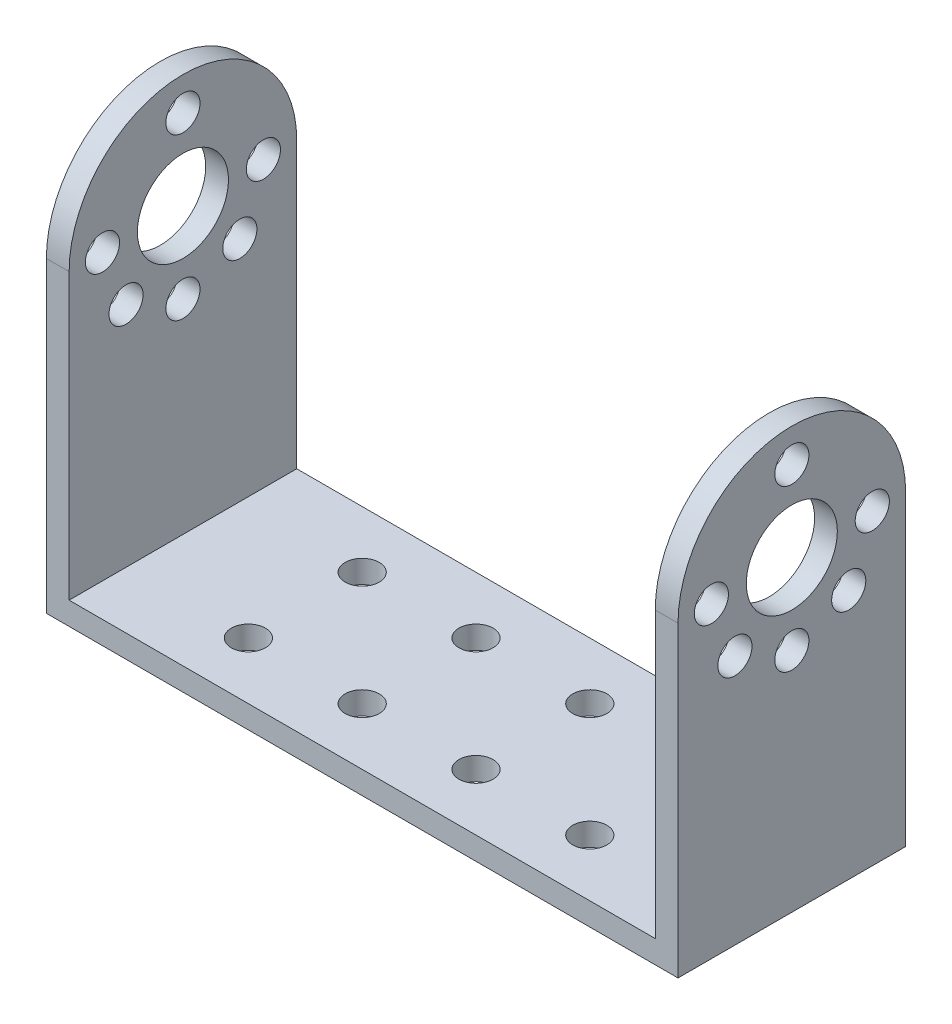
ISO-10303-21;
HEADER;
FILE_DESCRIPTION(('STEP AP214'),'2;1');
FILE_NAME('part.step','',(''),(''),'','','');
FILE_SCHEMA(('AUTOMOTIVE_DESIGN { 1 0 10303 214 1 1 1 1 }'));
ENDSEC;
DATA;
#1=APPLICATION_CONTEXT('core data for automotive mechanical design processes');
#2=APPLICATION_PROTOCOL_DEFINITION('international standard','automotive_design',2000,#1);
#3=PRODUCT_CONTEXT('',#1,'mechanical');
#4=PRODUCT('Part','Part','',(#3));
#5=PRODUCT_RELATED_PRODUCT_CATEGORY('part','',(#4));
#6=PRODUCT_DEFINITION_FORMATION('','',#4);
#7=PRODUCT_DEFINITION_CONTEXT('part definition',#1,'design');
#8=PRODUCT_DEFINITION('design','',#6,#7);
#9=PRODUCT_DEFINITION_SHAPE('','',#8);
#10=(LENGTH_UNIT() NAMED_UNIT(*) SI_UNIT(.MILLI.,.METRE.));
#11=(NAMED_UNIT(*) PLANE_ANGLE_UNIT() SI_UNIT($,.RADIAN.));
#12=(NAMED_UNIT(*) SI_UNIT($,.STERADIAN.) SOLID_ANGLE_UNIT());
#13=UNCERTAINTY_MEASURE_WITH_UNIT(LENGTH_MEASURE(1.E-05),#10,'distance_accuracy_value','');
#14=(GEOMETRIC_REPRESENTATION_CONTEXT(3) GLOBAL_UNCERTAINTY_ASSIGNED_CONTEXT((#13)) GLOBAL_UNIT_ASSIGNED_CONTEXT((#10,
#11,#12)) REPRESENTATION_CONTEXT('',''));
#15=CARTESIAN_POINT('',(0.,0.,0.));
#16=DIRECTION('',(0.,0.,1.));
#17=DIRECTION('',(1.,0.,0.));
#18=AXIS2_PLACEMENT_3D('',#15,#16,#17);
#19=CARTESIAN_POINT('',(-27.75,2.,10.));
#20=DIRECTION('',(1.,0.,0.));
#21=DIRECTION('',(0.,0.,-1.));
#22=AXIS2_PLACEMENT_3D('',#19,#20,#21);
#23=PLANE('',#22);
#24=CARTESIAN_POINT('',(-27.75,27.,7.07000000000007));
#25=DIRECTION('',(1.,0.,0.));
#26=DIRECTION('',(0.,0.,-1.));
#27=AXIS2_PLACEMENT_3D('',#24,#25,#26);
#28=CIRCLE('',#27,1.5);
#29=CARTESIAN_POINT('',(-27.75,27.,5.57000000000006));
#30=VERTEX_POINT('',#29);
#31=EDGE_CURVE('E278',#30,#30,#28,.T.);
#32=ORIENTED_EDGE('',*,*,#31,.T.);
#33=EDGE_LOOP('',(#32));
#34=FACE_BOUND('',#33,.T.);
#35=CARTESIAN_POINT('',(-27.75,22.0007550570111,4.99924494298895));
#36=DIRECTION('',(1.,0.,0.));
#37=DIRECTION('',(0.,0.,-1.));
#38=AXIS2_PLACEMENT_3D('',#35,#36,#37);
#39=CIRCLE('',#38,1.5);
#40=CARTESIAN_POINT('',(-27.75,22.0007550570111,3.49924494298895));
#41=VERTEX_POINT('',#40);
#42=EDGE_CURVE('E275',#41,#41,#39,.T.);
#43=ORIENTED_EDGE('',*,*,#42,.T.);
#44=EDGE_LOOP('',(#43));
#45=FACE_BOUND('',#44,.T.);
#46=CARTESIAN_POINT('',(-27.75,19.93,0.));
#47=DIRECTION('',(1.,0.,0.));
#48=DIRECTION('',(0.,0.,-1.));
#49=AXIS2_PLACEMENT_3D('',#46,#47,#48);
#50=CIRCLE('',#49,1.5);
#51=CARTESIAN_POINT('',(-27.75,19.93,-1.49999999999994));
#52=VERTEX_POINT('',#51);
#53=EDGE_CURVE('E293',#52,#52,#50,.F.);
#54=ORIENTED_EDGE('',*,*,#53,.F.);
#55=EDGE_LOOP('',(#54));
#56=FACE_BOUND('',#55,.T.);
#57=CARTESIAN_POINT('',(-27.75,22.0007550570111,-4.99924494298887));
#58=DIRECTION('',(1.,0.,0.));
#59=DIRECTION('',(0.,0.,-1.));
#60=AXIS2_PLACEMENT_3D('',#57,#58,#59);
#61=CIRCLE('',#60,1.5);
#62=CARTESIAN_POINT('',(-27.75,22.0007550570111,-6.49924494298887));
#63=VERTEX_POINT('',#62);
#64=EDGE_CURVE('E300',#63,#63,#61,.T.);
#65=ORIENTED_EDGE('',*,*,#64,.T.);
#66=EDGE_LOOP('',(#65));
#67=FACE_BOUND('',#66,.T.);
#68=CARTESIAN_POINT('',(-27.75,34.07,0.));
#69=DIRECTION('',(1.,0.,0.));
#70=DIRECTION('',(0.,0.,-1.));
#71=AXIS2_PLACEMENT_3D('',#68,#69,#70);
#72=CIRCLE('',#71,1.5);
#73=CARTESIAN_POINT('',(-27.75,34.07,-1.49999999999994));
#74=VERTEX_POINT('',#73);
#75=EDGE_CURVE('E307',#74,#74,#72,.T.);
#76=ORIENTED_EDGE('',*,*,#75,.T.);
#77=EDGE_LOOP('',(#76));
#78=FACE_BOUND('',#77,.T.);
#79=CARTESIAN_POINT('',(-27.75,27.,0.));
#80=DIRECTION('',(1.,0.,0.));
#81=DIRECTION('',(0.,0.,-1.));
#82=AXIS2_PLACEMENT_3D('',#79,#80,#81);
#83=CIRCLE('',#82,4.);
#84=CARTESIAN_POINT('',(-27.75,27.,-3.99999999999994));
#85=VERTEX_POINT('',#84);
#86=EDGE_CURVE('E314',#85,#85,#83,.T.);
#87=ORIENTED_EDGE('',*,*,#86,.T.);
#88=EDGE_LOOP('',(#87));
#89=FACE_BOUND('',#88,.T.);
#90=CARTESIAN_POINT('',(-27.75,27.,-7.06999999999995));
#91=DIRECTION('',(1.,0.,0.));
#92=DIRECTION('',(0.,0.,-1.));
#93=AXIS2_PLACEMENT_3D('',#90,#91,#92);
#94=CIRCLE('',#93,1.5);
#95=CARTESIAN_POINT('',(-27.75,27.,-8.56999999999995));
#96=VERTEX_POINT('',#95);
#97=EDGE_CURVE('E205',#96,#96,#94,.F.);
#98=ORIENTED_EDGE('',*,*,#97,.F.);
#99=EDGE_LOOP('',(#98));
#100=FACE_BOUND('',#99,.T.);
#101=CARTESIAN_POINT('',(-27.75,27.,0.));
#102=DIRECTION('',(1.,0.,0.));
#103=DIRECTION('',(0.,0.,-1.));
#104=AXIS2_PLACEMENT_3D('',#101,#102,#103);
#105=CIRCLE('',#104,10.);
#106=CARTESIAN_POINT('',(-27.75,27.,-9.99999999999994));
#107=VERTEX_POINT('',#106);
#108=CARTESIAN_POINT('',(-27.75,27.,10.0000000000001));
#109=VERTEX_POINT('',#108);
#110=EDGE_CURVE('E329',#107,#109,#105,.T.);
#111=ORIENTED_EDGE('',*,*,#110,.F.);
#112=DIRECTION('',(0.,-1.,0.));
#113=VECTOR('',#112,1.);
#114=CARTESIAN_POINT('',(-27.75,2.,-9.99999999999998));
#115=LINE('',#114,#113);
#116=CARTESIAN_POINT('',(-27.75,0.,-9.99999999999998));
#117=VERTEX_POINT('',#116);
#118=EDGE_CURVE('E211',#107,#117,#115,.T.);
#119=ORIENTED_EDGE('',*,*,#118,.T.);
#120=DIRECTION('',(0.,0.,1.));
#121=VECTOR('',#120,1.);
#122=CARTESIAN_POINT('',(-27.75,0.,10.));
#123=LINE('',#122,#121);
#124=CARTESIAN_POINT('',(-27.75,0.,10.));
#125=VERTEX_POINT('',#124);
#126=EDGE_CURVE('E232',#117,#125,#123,.T.);
#127=ORIENTED_EDGE('',*,*,#126,.T.);
#128=DIRECTION('',(0.,-1.,0.));
#129=VECTOR('',#128,1.);
#130=CARTESIAN_POINT('',(-27.75,2.,10.));
#131=LINE('',#130,#129);
#132=EDGE_CURVE('E12',#109,#125,#131,.T.);
#133=ORIENTED_EDGE('',*,*,#132,.F.);
#134=EDGE_LOOP('',(#111,#119,#127,#133));
#135=FACE_BOUND('',#134,.T.);
#136=ADVANCED_FACE('F117',(#34,#45,#56,#67,#78,#89,#100,#135),#23,.F.);
#137=CARTESIAN_POINT('',(27.75,2.,9.99999999999999));
#138=DIRECTION('',(-1.,0.,0.));
#139=DIRECTION('',(0.,0.,1.));
#140=AXIS2_PLACEMENT_3D('',#137,#138,#139);
#141=PLANE('',#140);
#142=CARTESIAN_POINT('',(27.75,27.,7.06999999999999));
#143=DIRECTION('',(1.,0.,0.));
#144=DIRECTION('',(0.,0.,-1.));
#145=AXIS2_PLACEMENT_3D('',#142,#143,#144);
#146=CIRCLE('',#145,1.5);
#147=CARTESIAN_POINT('',(27.75,27.,5.56999999999999));
#148=VERTEX_POINT('',#147);
#149=EDGE_CURVE('E696',#148,#148,#146,.T.);
#150=ORIENTED_EDGE('',*,*,#149,.F.);
#151=EDGE_LOOP('',(#150));
#152=FACE_BOUND('',#151,.T.);
#153=CARTESIAN_POINT('',(27.75,22.0007550570111,4.99924494298887));
#154=DIRECTION('',(1.,0.,0.));
#155=DIRECTION('',(0.,0.,-1.));
#156=AXIS2_PLACEMENT_3D('',#153,#154,#155);
#157=CIRCLE('',#156,1.5);
#158=CARTESIAN_POINT('',(27.75,22.0007550570111,3.49924494298888));
#159=VERTEX_POINT('',#158);
#160=EDGE_CURVE('E271',#159,#159,#157,.T.);
#161=ORIENTED_EDGE('',*,*,#160,.F.);
#162=EDGE_LOOP('',(#161));
#163=FACE_BOUND('',#162,.T.);
#164=CARTESIAN_POINT('',(27.75,19.93,0.));
#165=DIRECTION('',(1.,0.,0.));
#166=DIRECTION('',(0.,0.,-1.));
#167=AXIS2_PLACEMENT_3D('',#164,#165,#166);
#168=CIRCLE('',#167,1.5);
#169=CARTESIAN_POINT('',(27.75,19.93,-1.50000000000001));
#170=VERTEX_POINT('',#169);
#171=EDGE_CURVE('E267',#170,#170,#168,.F.);
#172=ORIENTED_EDGE('',*,*,#171,.T.);
#173=EDGE_LOOP('',(#172));
#174=FACE_BOUND('',#173,.T.);
#175=CARTESIAN_POINT('',(27.75,22.0007550570111,-4.99924494298894));
#176=DIRECTION('',(1.,0.,0.));
#177=DIRECTION('',(0.,0.,-1.));
#178=AXIS2_PLACEMENT_3D('',#175,#176,#177);
#179=CIRCLE('',#178,1.5);
#180=CARTESIAN_POINT('',(27.75,22.0007550570111,-6.49924494298894));
#181=VERTEX_POINT('',#180);
#182=EDGE_CURVE('E263',#181,#181,#179,.T.);
#183=ORIENTED_EDGE('',*,*,#182,.F.);
#184=EDGE_LOOP('',(#183));
#185=FACE_BOUND('',#184,.T.);
#186=CARTESIAN_POINT('',(27.75,34.07,0.));
#187=DIRECTION('',(1.,0.,0.));
#188=DIRECTION('',(0.,0.,-1.));
#189=AXIS2_PLACEMENT_3D('',#186,#187,#188);
#190=CIRCLE('',#189,1.5);
#191=CARTESIAN_POINT('',(27.75,34.07,-1.50000000000001));
#192=VERTEX_POINT('',#191);
#193=EDGE_CURVE('E258',#192,#192,#190,.T.);
#194=ORIENTED_EDGE('',*,*,#193,.F.);
#195=EDGE_LOOP('',(#194));
#196=FACE_BOUND('',#195,.T.);
#197=CARTESIAN_POINT('',(27.75,27.,0.));
#198=DIRECTION('',(1.,0.,0.));
#199=DIRECTION('',(0.,0.,-1.));
#200=AXIS2_PLACEMENT_3D('',#197,#198,#199);
#201=CIRCLE('',#200,4.);
#202=CARTESIAN_POINT('',(27.75,27.,-4.00000000000001));
#203=VERTEX_POINT('',#202);
#204=EDGE_CURVE('E253',#203,#203,#201,.T.);
#205=ORIENTED_EDGE('',*,*,#204,.F.);
#206=EDGE_LOOP('',(#205));
#207=FACE_BOUND('',#206,.T.);
#208=CARTESIAN_POINT('',(27.75,27.,-7.07000000000003));
#209=DIRECTION('',(1.,0.,0.));
#210=DIRECTION('',(0.,0.,-1.));
#211=AXIS2_PLACEMENT_3D('',#208,#209,#210);
#212=CIRCLE('',#211,1.5);
#213=CARTESIAN_POINT('',(27.75,27.,-8.57000000000003));
#214=VERTEX_POINT('',#213);
#215=EDGE_CURVE('E248',#214,#214,#212,.F.);
#216=ORIENTED_EDGE('',*,*,#215,.T.);
#217=EDGE_LOOP('',(#216));
#218=FACE_BOUND('',#217,.T.);
#219=DIRECTION('',(0.,-1.,0.));
#220=VECTOR('',#219,1.);
#221=CARTESIAN_POINT('',(27.75,2.,-10.));
#222=LINE('',#221,#220);
#223=CARTESIAN_POINT('',(27.75,27.,-10.));
#224=VERTEX_POINT('',#223);
#225=CARTESIAN_POINT('',(27.75,0.,-10.));
#226=VERTEX_POINT('',#225);
#227=EDGE_CURVE('E201',#224,#226,#222,.T.);
#228=ORIENTED_EDGE('',*,*,#227,.F.);
#229=CARTESIAN_POINT('',(27.75,27.,0.));
#230=DIRECTION('',(1.,0.,0.));
#231=DIRECTION('',(0.,0.,-1.));
#232=AXIS2_PLACEMENT_3D('',#229,#230,#231);
#233=CIRCLE('',#232,10.);
#234=CARTESIAN_POINT('',(27.75,27.,9.99999999999999));
#235=VERTEX_POINT('',#234);
#236=EDGE_CURVE('E186',#224,#235,#233,.T.);
#237=ORIENTED_EDGE('',*,*,#236,.T.);
#238=DIRECTION('',(0.,-1.,0.));
#239=VECTOR('',#238,1.);
#240=CARTESIAN_POINT('',(27.75,2.,9.99999999999999));
#241=LINE('',#240,#239);
#242=CARTESIAN_POINT('',(27.75,0.,9.99999999999999));
#243=VERTEX_POINT('',#242);
#244=EDGE_CURVE('E125',#235,#243,#241,.T.);
#245=ORIENTED_EDGE('',*,*,#244,.T.);
#246=DIRECTION('',(0.,0.,-1.));
#247=VECTOR('',#246,1.);
#248=CARTESIAN_POINT('',(27.75,0.,9.99999999999999));
#249=LINE('',#248,#247);
#250=EDGE_CURVE('E209',#243,#226,#249,.T.);
#251=ORIENTED_EDGE('',*,*,#250,.T.);
#252=EDGE_LOOP('',(#228,#237,#245,#251));
#253=FACE_BOUND('',#252,.T.);
#254=ADVANCED_FACE('F207',(#152,#163,#174,#185,#196,#207,#218,#253),#141,.F.);
#255=CARTESIAN_POINT('',(-25.75,37.,-9.99999999999998));
#256=DIRECTION('',(-1.,0.,0.));
#257=DIRECTION('',(0.,0.,1.));
#258=AXIS2_PLACEMENT_3D('',#255,#256,#257);
#259=PLANE('',#258);
#260=CARTESIAN_POINT('',(-25.75,27.,7.07000000000006));
#261=DIRECTION('',(-1.,0.,0.));
#262=DIRECTION('',(0.,0.,1.));
#263=AXIS2_PLACEMENT_3D('',#260,#261,#262);
#264=CIRCLE('',#263,1.5);
#265=CARTESIAN_POINT('',(-25.75,27.,8.57000000000006));
#266=VERTEX_POINT('',#265);
#267=EDGE_CURVE('E283',#266,#266,#264,.T.);
#268=ORIENTED_EDGE('',*,*,#267,.T.);
#269=EDGE_LOOP('',(#268));
#270=FACE_BOUND('',#269,.T.);
#271=CARTESIAN_POINT('',(-25.75,22.0007550570111,4.99924494298895));
#272=DIRECTION('',(-1.,0.,0.));
#273=DIRECTION('',(0.,0.,1.));
#274=AXIS2_PLACEMENT_3D('',#271,#272,#273);
#275=CIRCLE('',#274,1.5);
#276=CARTESIAN_POINT('',(-25.75,22.0007550570111,6.49924494298895));
#277=VERTEX_POINT('',#276);
#278=EDGE_CURVE('E270',#277,#277,#275,.T.);
#279=ORIENTED_EDGE('',*,*,#278,.T.);
#280=EDGE_LOOP('',(#279));
#281=FACE_BOUND('',#280,.T.);
#282=CARTESIAN_POINT('',(-25.75,19.93,0.));
#283=DIRECTION('',(-1.,0.,0.));
#284=DIRECTION('',(0.,0.,1.));
#285=AXIS2_PLACEMENT_3D('',#282,#283,#284);
#286=CIRCLE('',#285,1.5);
#287=CARTESIAN_POINT('',(-25.75,19.93,1.50000000000006));
#288=VERTEX_POINT('',#287);
#289=EDGE_CURVE('E266',#288,#288,#286,.F.);
#290=ORIENTED_EDGE('',*,*,#289,.F.);
#291=EDGE_LOOP('',(#290));
#292=FACE_BOUND('',#291,.T.);
#293=CARTESIAN_POINT('',(-25.75,22.0007550570111,-4.99924494298887));
#294=DIRECTION('',(-1.,0.,0.));
#295=DIRECTION('',(0.,0.,1.));
#296=AXIS2_PLACEMENT_3D('',#293,#294,#295);
#297=CIRCLE('',#296,1.5);
#298=CARTESIAN_POINT('',(-25.75,22.0007550570111,-3.49924494298887));
#299=VERTEX_POINT('',#298);
#300=EDGE_CURVE('E262',#299,#299,#297,.T.);
#301=ORIENTED_EDGE('',*,*,#300,.T.);
#302=EDGE_LOOP('',(#301));
#303=FACE_BOUND('',#302,.T.);
#304=CARTESIAN_POINT('',(-25.75,34.07,0.));
#305=DIRECTION('',(-1.,0.,0.));
#306=DIRECTION('',(0.,0.,1.));
#307=AXIS2_PLACEMENT_3D('',#304,#305,#306);
#308=CIRCLE('',#307,1.5);
#309=CARTESIAN_POINT('',(-25.75,34.07,1.50000000000006));
#310=VERTEX_POINT('',#309);
#311=EDGE_CURVE('E257',#310,#310,#308,.T.);
#312=ORIENTED_EDGE('',*,*,#311,.T.);
#313=EDGE_LOOP('',(#312));
#314=FACE_BOUND('',#313,.T.);
#315=CARTESIAN_POINT('',(-25.75,27.,0.));
#316=DIRECTION('',(-1.,0.,0.));
#317=DIRECTION('',(0.,0.,1.));
#318=AXIS2_PLACEMENT_3D('',#315,#316,#317);
#319=CIRCLE('',#318,4.);
#320=CARTESIAN_POINT('',(-25.75,27.,4.00000000000006));
#321=VERTEX_POINT('',#320);
#322=EDGE_CURVE('E252',#321,#321,#319,.T.);
#323=ORIENTED_EDGE('',*,*,#322,.T.);
#324=EDGE_LOOP('',(#323));
#325=FACE_BOUND('',#324,.T.);
#326=CARTESIAN_POINT('',(-25.75,27.,-7.06999999999995));
#327=DIRECTION('',(-1.,0.,0.));
#328=DIRECTION('',(0.,0.,1.));
#329=AXIS2_PLACEMENT_3D('',#326,#327,#328);
#330=CIRCLE('',#329,1.5);
#331=CARTESIAN_POINT('',(-25.75,27.,-5.56999999999995));
#332=VERTEX_POINT('',#331);
#333=EDGE_CURVE('E247',#332,#332,#330,.F.);
#334=ORIENTED_EDGE('',*,*,#333,.F.);
#335=EDGE_LOOP('',(#334));
#336=FACE_BOUND('',#335,.T.);
#337=DIRECTION('',(0.,-1.,0.));
#338=VECTOR('',#337,1.);
#339=CARTESIAN_POINT('',(-25.75,37.,-9.99999999999998));
#340=LINE('',#339,#338);
#341=CARTESIAN_POINT('',(-25.75,27.,-9.99999999999994));
#342=VERTEX_POINT('',#341);
#343=CARTESIAN_POINT('',(-25.75,2.,-9.99999999999998));
#344=VERTEX_POINT('',#343);
#345=EDGE_CURVE('E241',#342,#344,#340,.T.);
#346=ORIENTED_EDGE('',*,*,#345,.F.);
#347=CARTESIAN_POINT('',(-25.75,27.,0.));
#348=DIRECTION('',(-1.,0.,0.));
#349=DIRECTION('',(0.,0.,1.));
#350=AXIS2_PLACEMENT_3D('',#347,#348,#349);
#351=CIRCLE('',#350,10.);
#352=CARTESIAN_POINT('',(-25.75,27.,10.0000000000001));
#353=VERTEX_POINT('',#352);
#354=EDGE_CURVE('E327',#353,#342,#351,.T.);
#355=ORIENTED_EDGE('',*,*,#354,.F.);
#356=DIRECTION('',(0.,-1.,0.));
#357=VECTOR('',#356,1.);
#358=CARTESIAN_POINT('',(-25.75,37.,10.));
#359=LINE('',#358,#357);
#360=CARTESIAN_POINT('',(-25.75,2.,10.));
#361=VERTEX_POINT('',#360);
#362=EDGE_CURVE('E141',#353,#361,#359,.T.);
#363=ORIENTED_EDGE('',*,*,#362,.T.);
#364=DIRECTION('',(0.,0.,-1.));
#365=VECTOR('',#364,1.);
#366=CARTESIAN_POINT('',(-25.75,2.,-9.99999999999998));
#367=LINE('',#366,#365);
#368=EDGE_CURVE('E222',#361,#344,#367,.T.);
#369=ORIENTED_EDGE('',*,*,#368,.T.);
#370=EDGE_LOOP('',(#346,#355,#363,#369));
#371=FACE_BOUND('',#370,.T.);
#372=ADVANCED_FACE('F407',(#270,#281,#292,#303,#314,#325,#336,#371),#259,.F.);
#373=CARTESIAN_POINT('',(25.75,37.,-10.));
#374=DIRECTION('',(1.,0.,0.));
#375=DIRECTION('',(0.,0.,-1.));
#376=AXIS2_PLACEMENT_3D('',#373,#374,#375);
#377=PLANE('',#376);
#378=CARTESIAN_POINT('',(25.75,27.,7.06999999999999));
#379=DIRECTION('',(1.,0.,0.));
#380=DIRECTION('',(0.,0.,-1.));
#381=AXIS2_PLACEMENT_3D('',#378,#379,#380);
#382=CIRCLE('',#381,1.5);
#383=CARTESIAN_POINT('',(25.75,27.,5.56999999999999));
#384=VERTEX_POINT('',#383);
#385=EDGE_CURVE('E120',#384,#384,#382,.T.);
#386=ORIENTED_EDGE('',*,*,#385,.T.);
#387=EDGE_LOOP('',(#386));
#388=FACE_BOUND('',#387,.T.);
#389=CARTESIAN_POINT('',(25.75,22.0007550570111,4.99924494298888));
#390=DIRECTION('',(1.,0.,0.));
#391=DIRECTION('',(0.,0.,-1.));
#392=AXIS2_PLACEMENT_3D('',#389,#390,#391);
#393=CIRCLE('',#392,1.5);
#394=CARTESIAN_POINT('',(25.75,22.0007550570111,3.49924494298888));
#395=VERTEX_POINT('',#394);
#396=EDGE_CURVE('E268',#395,#395,#393,.T.);
#397=ORIENTED_EDGE('',*,*,#396,.T.);
#398=EDGE_LOOP('',(#397));
#399=FACE_BOUND('',#398,.T.);
#400=CARTESIAN_POINT('',(25.75,19.93,0.));
#401=DIRECTION('',(1.,0.,0.));
#402=DIRECTION('',(0.,0.,-1.));
#403=AXIS2_PLACEMENT_3D('',#400,#401,#402);
#404=CIRCLE('',#403,1.5);
#405=CARTESIAN_POINT('',(25.75,19.93,-1.50000000000001));
#406=VERTEX_POINT('',#405);
#407=EDGE_CURVE('E264',#406,#406,#404,.F.);
#408=ORIENTED_EDGE('',*,*,#407,.F.);
#409=EDGE_LOOP('',(#408));
#410=FACE_BOUND('',#409,.T.);
#411=CARTESIAN_POINT('',(25.75,22.0007550570111,-4.99924494298894));
#412=DIRECTION('',(1.,0.,0.));
#413=DIRECTION('',(0.,0.,-1.));
#414=AXIS2_PLACEMENT_3D('',#411,#412,#413);
#415=CIRCLE('',#414,1.5);
#416=CARTESIAN_POINT('',(25.75,22.0007550570111,-6.49924494298894));
#417=VERTEX_POINT('',#416);
#418=EDGE_CURVE('E259',#417,#417,#415,.T.);
#419=ORIENTED_EDGE('',*,*,#418,.T.);
#420=EDGE_LOOP('',(#419));
#421=FACE_BOUND('',#420,.T.);
#422=CARTESIAN_POINT('',(25.75,34.07,0.));
#423=DIRECTION('',(1.,0.,0.));
#424=DIRECTION('',(0.,0.,-1.));
#425=AXIS2_PLACEMENT_3D('',#422,#423,#424);
#426=CIRCLE('',#425,1.5);
#427=CARTESIAN_POINT('',(25.75,34.07,-1.50000000000001));
#428=VERTEX_POINT('',#427);
#429=EDGE_CURVE('E254',#428,#428,#426,.T.);
#430=ORIENTED_EDGE('',*,*,#429,.T.);
#431=EDGE_LOOP('',(#430));
#432=FACE_BOUND('',#431,.T.);
#433=CARTESIAN_POINT('',(25.75,27.,0.));
#434=DIRECTION('',(1.,0.,0.));
#435=DIRECTION('',(0.,0.,-1.));
#436=AXIS2_PLACEMENT_3D('',#433,#434,#435);
#437=CIRCLE('',#436,4.);
#438=CARTESIAN_POINT('',(25.75,27.,-4.00000000000001));
#439=VERTEX_POINT('',#438);
#440=EDGE_CURVE('E249',#439,#439,#437,.T.);
#441=ORIENTED_EDGE('',*,*,#440,.T.);
#442=EDGE_LOOP('',(#441));
#443=FACE_BOUND('',#442,.T.);
#444=CARTESIAN_POINT('',(25.75,27.,-7.07000000000003));
#445=DIRECTION('',(1.,0.,0.));
#446=DIRECTION('',(0.,0.,-1.));
#447=AXIS2_PLACEMENT_3D('',#444,#445,#446);
#448=CIRCLE('',#447,1.5);
#449=CARTESIAN_POINT('',(25.75,27.,-8.57000000000003));
#450=VERTEX_POINT('',#449);
#451=EDGE_CURVE('E243',#450,#450,#448,.F.);
#452=ORIENTED_EDGE('',*,*,#451,.F.);
#453=EDGE_LOOP('',(#452));
#454=FACE_BOUND('',#453,.T.);
#455=CARTESIAN_POINT('',(25.75,27.,0.));
#456=DIRECTION('',(1.,0.,0.));
#457=DIRECTION('',(0.,0.,-1.));
#458=AXIS2_PLACEMENT_3D('',#455,#456,#457);
#459=CIRCLE('',#458,10.);
#460=CARTESIAN_POINT('',(25.75,27.,-10.));
#461=VERTEX_POINT('',#460);
#462=CARTESIAN_POINT('',(25.75,27.,9.99999999999999));
#463=VERTEX_POINT('',#462);
#464=EDGE_CURVE('E325',#461,#463,#459,.T.);
#465=ORIENTED_EDGE('',*,*,#464,.F.);
#466=DIRECTION('',(0.,-1.,0.));
#467=VECTOR('',#466,1.);
#468=CARTESIAN_POINT('',(25.75,37.,-10.));
#469=LINE('',#468,#467);
#470=CARTESIAN_POINT('',(25.75,2.,-10.));
#471=VERTEX_POINT('',#470);
#472=EDGE_CURVE('E204',#461,#471,#469,.T.);
#473=ORIENTED_EDGE('',*,*,#472,.T.);
#474=DIRECTION('',(0.,0.,1.));
#475=VECTOR('',#474,1.);
#476=CARTESIAN_POINT('',(25.75,2.,-10.));
#477=LINE('',#476,#475);
#478=CARTESIAN_POINT('',(25.75,2.,9.99999999999999));
#479=VERTEX_POINT('',#478);
#480=EDGE_CURVE('E331',#471,#479,#477,.T.);
#481=ORIENTED_EDGE('',*,*,#480,.T.);
#482=DIRECTION('',(0.,-1.,0.));
#483=VECTOR('',#482,1.);
#484=CARTESIAN_POINT('',(25.75,37.,10.));
#485=LINE('',#484,#483);
#486=EDGE_CURVE('E133',#463,#479,#485,.T.);
#487=ORIENTED_EDGE('',*,*,#486,.F.);
#488=EDGE_LOOP('',(#465,#473,#481,#487));
#489=FACE_BOUND('',#488,.T.);
#490=ADVANCED_FACE('F441',(#388,#399,#410,#421,#432,#443,#454,#489),#377,.F.);
#491=CARTESIAN_POINT('',(27.75,2.,9.99999999999999));
#492=DIRECTION('',(0.,0.,-1.));
#493=DIRECTION('',(-1.,0.,0.));
#494=AXIS2_PLACEMENT_3D('',#491,#492,#493);
#495=PLANE('',#494);
#496=DIRECTION('',(1.,0.,0.));
#497=VECTOR('',#496,1.);
#498=CARTESIAN_POINT('',(-37.25,27.,10.0000000000001));
#499=LINE('',#498,#497);
#500=EDGE_CURVE('E324',#109,#353,#499,.T.);
#501=ORIENTED_EDGE('',*,*,#500,.F.);
#502=ORIENTED_EDGE('',*,*,#132,.T.);
#503=DIRECTION('',(1.,0.,0.));
#504=VECTOR('',#503,1.);
#505=CARTESIAN_POINT('',(27.75,0.,9.99999999999999));
#506=LINE('',#505,#504);
#507=EDGE_CURVE('E382',#125,#243,#506,.T.);
#508=ORIENTED_EDGE('',*,*,#507,.T.);
#509=ORIENTED_EDGE('',*,*,#244,.F.);
#510=EDGE_CURVE('E191',#463,#235,#499,.T.);
#511=ORIENTED_EDGE('',*,*,#510,.F.);
#512=ORIENTED_EDGE('',*,*,#486,.T.);
#513=DIRECTION('',(1.,0.,0.));
#514=VECTOR('',#513,1.);
#515=CARTESIAN_POINT('',(27.75,2.,9.99999999999999));
#516=LINE('',#515,#514);
#517=EDGE_CURVE('E218',#361,#479,#516,.T.);
#518=ORIENTED_EDGE('',*,*,#517,.F.);
#519=ORIENTED_EDGE('',*,*,#362,.F.);
#520=EDGE_LOOP('',(#501,#502,#508,#509,#511,#512,#518,#519));
#521=FACE_BOUND('',#520,.T.);
#522=ADVANCED_FACE('F436',(#521),#495,.F.);
#523=CARTESIAN_POINT('',(0.,2.,0.));
#524=DIRECTION('',(0.,1.,0.));
#525=DIRECTION('',(0.,0.,1.));
#526=AXIS2_PLACEMENT_3D('',#523,#524,#525);
#527=PLANE('',#526);
#528=CARTESIAN_POINT('',(5.,2.,-4.99999999999998));
#529=DIRECTION('',(0.,1.,0.));
#530=DIRECTION('',(0.,0.,-1.));
#531=AXIS2_PLACEMENT_3D('',#528,#529,#530);
#532=CIRCLE('',#531,1.5);
#533=CARTESIAN_POINT('',(5.,2.,-6.49999999999998));
#534=VERTEX_POINT('',#533);
#535=EDGE_CURVE('E343',#534,#534,#532,.T.);
#536=ORIENTED_EDGE('',*,*,#535,.F.);
#537=EDGE_LOOP('',(#536));
#538=FACE_BOUND('',#537,.T.);
#539=CARTESIAN_POINT('',(15.,2.,5.00000000000002));
#540=DIRECTION('',(0.,1.,0.));
#541=DIRECTION('',(0.,0.,-1.));
#542=AXIS2_PLACEMENT_3D('',#539,#540,#541);
#543=CIRCLE('',#542,1.5);
#544=CARTESIAN_POINT('',(15.,2.,3.50000000000002));
#545=VERTEX_POINT('',#544);
#546=EDGE_CURVE('E355',#545,#545,#543,.T.);
#547=ORIENTED_EDGE('',*,*,#546,.F.);
#548=EDGE_LOOP('',(#547));
#549=FACE_BOUND('',#548,.T.);
#550=CARTESIAN_POINT('',(-15.,2.,5.00000000000002));
#551=DIRECTION('',(0.,1.,0.));
#552=DIRECTION('',(0.,0.,1.));
#553=AXIS2_PLACEMENT_3D('',#550,#551,#552);
#554=CIRCLE('',#553,1.5);
#555=CARTESIAN_POINT('',(-15.,2.,6.50000000000002));
#556=VERTEX_POINT('',#555);
#557=EDGE_CURVE('E367',#556,#556,#554,.T.);
#558=ORIENTED_EDGE('',*,*,#557,.F.);
#559=EDGE_LOOP('',(#558));
#560=FACE_BOUND('',#559,.T.);
#561=CARTESIAN_POINT('',(-15.,2.,-4.99999999999998));
#562=DIRECTION('',(0.,1.,0.));
#563=DIRECTION('',(0.,0.,1.));
#564=AXIS2_PLACEMENT_3D('',#561,#562,#563);
#565=CIRCLE('',#564,1.5);
#566=CARTESIAN_POINT('',(-15.,2.,-3.49999999999998));
#567=VERTEX_POINT('',#566);
#568=EDGE_CURVE('E377',#567,#567,#565,.T.);
#569=ORIENTED_EDGE('',*,*,#568,.F.);
#570=EDGE_LOOP('',(#569));
#571=FACE_BOUND('',#570,.T.);
#572=CARTESIAN_POINT('',(-5.,2.,-4.99999999999998));
#573=DIRECTION('',(0.,1.,0.));
#574=DIRECTION('',(0.,0.,1.));
#575=AXIS2_PLACEMENT_3D('',#572,#573,#574);
#576=CIRCLE('',#575,1.5);
#577=CARTESIAN_POINT('',(-5.,2.,-3.49999999999998));
#578=VERTEX_POINT('',#577);
#579=EDGE_CURVE('E373',#578,#578,#576,.T.);
#580=ORIENTED_EDGE('',*,*,#579,.F.);
#581=EDGE_LOOP('',(#580));
#582=FACE_BOUND('',#581,.T.);
#583=CARTESIAN_POINT('',(-5.,2.,5.00000000000002));
#584=DIRECTION('',(0.,1.,0.));
#585=DIRECTION('',(0.,0.,1.));
#586=AXIS2_PLACEMENT_3D('',#583,#584,#585);
#587=CIRCLE('',#586,1.5);
#588=CARTESIAN_POINT('',(-5.,2.,6.50000000000002));
#589=VERTEX_POINT('',#588);
#590=EDGE_CURVE('E361',#589,#589,#587,.T.);
#591=ORIENTED_EDGE('',*,*,#590,.F.);
#592=EDGE_LOOP('',(#591));
#593=FACE_BOUND('',#592,.T.);
#594=CARTESIAN_POINT('',(5.00000000000001,2.,5.00000000000002));
#595=DIRECTION('',(0.,1.,0.));
#596=DIRECTION('',(0.,0.,-1.));
#597=AXIS2_PLACEMENT_3D('',#594,#595,#596);
#598=CIRCLE('',#597,1.5);
#599=CARTESIAN_POINT('',(5.00000000000001,2.,3.50000000000002));
#600=VERTEX_POINT('',#599);
#601=EDGE_CURVE('E349',#600,#600,#598,.T.);
#602=ORIENTED_EDGE('',*,*,#601,.F.);
#603=EDGE_LOOP('',(#602));
#604=FACE_BOUND('',#603,.T.);
#605=CARTESIAN_POINT('',(15.,2.,-4.99999999999998));
#606=DIRECTION('',(0.,1.,0.));
#607=DIRECTION('',(0.,0.,-1.));
#608=AXIS2_PLACEMENT_3D('',#605,#606,#607);
#609=CIRCLE('',#608,1.5);
#610=CARTESIAN_POINT('',(15.,2.,-6.49999999999998));
#611=VERTEX_POINT('',#610);
#612=EDGE_CURVE('E337',#611,#611,#609,.T.);
#613=ORIENTED_EDGE('',*,*,#612,.F.);
#614=EDGE_LOOP('',(#613));
#615=FACE_BOUND('',#614,.T.);
#616=ORIENTED_EDGE('',*,*,#517,.T.);
#617=ORIENTED_EDGE('',*,*,#480,.F.);
#618=DIRECTION('',(-1.,0.,0.));
#619=VECTOR('',#618,1.);
#620=CARTESIAN_POINT('',(27.75,2.,-10.));
#621=LINE('',#620,#619);
#622=EDGE_CURVE('E214',#471,#344,#621,.T.);
#623=ORIENTED_EDGE('',*,*,#622,.T.);
#624=ORIENTED_EDGE('',*,*,#368,.F.);
#625=EDGE_LOOP('',(#616,#617,#623,#624));
#626=FACE_BOUND('',#625,.T.);
#627=ADVANCED_FACE('F439',(#538,#549,#560,#571,#582,#593,#604,#615,#626),#527,.T.);
#628=CARTESIAN_POINT('',(0.,0.,0.));
#629=DIRECTION('',(0.,1.,0.));
#630=DIRECTION('',(0.,0.,1.));
#631=AXIS2_PLACEMENT_3D('',#628,#629,#630);
#632=PLANE('',#631);
#633=ORIENTED_EDGE('',*,*,#126,.F.);
#634=DIRECTION('',(-1.,0.,0.));
#635=VECTOR('',#634,1.);
#636=CARTESIAN_POINT('',(27.75,0.,-10.));
#637=LINE('',#636,#635);
#638=EDGE_CURVE('E221',#226,#117,#637,.T.);
#639=ORIENTED_EDGE('',*,*,#638,.F.);
#640=ORIENTED_EDGE('',*,*,#250,.F.);
#641=ORIENTED_EDGE('',*,*,#507,.F.);
#642=EDGE_LOOP('',(#633,#639,#640,#641));
#643=FACE_BOUND('',#642,.T.);
#644=CARTESIAN_POINT('',(-15.,0.,-4.99999999999998));
#645=DIRECTION('',(0.,1.,0.));
#646=DIRECTION('',(0.,0.,1.));
#647=AXIS2_PLACEMENT_3D('',#644,#645,#646);
#648=CIRCLE('',#647,1.5);
#649=CARTESIAN_POINT('',(-15.,0.,-3.49999999999998));
#650=VERTEX_POINT('',#649);
#651=EDGE_CURVE('E228',#650,#650,#648,.T.);
#652=ORIENTED_EDGE('',*,*,#651,.T.);
#653=EDGE_LOOP('',(#652));
#654=FACE_BOUND('',#653,.T.);
#655=CARTESIAN_POINT('',(-5.,0.,-4.99999999999998));
#656=DIRECTION('',(0.,1.,0.));
#657=DIRECTION('',(0.,0.,1.));
#658=AXIS2_PLACEMENT_3D('',#655,#656,#657);
#659=CIRCLE('',#658,1.5);
#660=CARTESIAN_POINT('',(-5.,0.,-3.49999999999998));
#661=VERTEX_POINT('',#660);
#662=EDGE_CURVE('E370',#661,#661,#659,.T.);
#663=ORIENTED_EDGE('',*,*,#662,.T.);
#664=EDGE_LOOP('',(#663));
#665=FACE_BOUND('',#664,.T.);
#666=CARTESIAN_POINT('',(-15.,0.,5.00000000000002));
#667=DIRECTION('',(0.,1.,0.));
#668=DIRECTION('',(0.,0.,1.));
#669=AXIS2_PLACEMENT_3D('',#666,#667,#668);
#670=CIRCLE('',#669,1.5);
#671=CARTESIAN_POINT('',(-15.,0.,6.50000000000002));
#672=VERTEX_POINT('',#671);
#673=EDGE_CURVE('E364',#672,#672,#670,.T.);
#674=ORIENTED_EDGE('',*,*,#673,.T.);
#675=EDGE_LOOP('',(#674));
#676=FACE_BOUND('',#675,.T.);
#677=CARTESIAN_POINT('',(-5.,0.,5.00000000000002));
#678=DIRECTION('',(0.,1.,0.));
#679=DIRECTION('',(0.,0.,1.));
#680=AXIS2_PLACEMENT_3D('',#677,#678,#679);
#681=CIRCLE('',#680,1.5);
#682=CARTESIAN_POINT('',(-5.,0.,6.50000000000002));
#683=VERTEX_POINT('',#682);
#684=EDGE_CURVE('E358',#683,#683,#681,.T.);
#685=ORIENTED_EDGE('',*,*,#684,.T.);
#686=EDGE_LOOP('',(#685));
#687=FACE_BOUND('',#686,.T.);
#688=CARTESIAN_POINT('',(15.,0.,5.00000000000002));
#689=DIRECTION('',(0.,1.,0.));
#690=DIRECTION('',(0.,0.,-1.));
#691=AXIS2_PLACEMENT_3D('',#688,#689,#690);
#692=CIRCLE('',#691,1.5);
#693=CARTESIAN_POINT('',(15.,0.,3.50000000000002));
#694=VERTEX_POINT('',#693);
#695=EDGE_CURVE('E352',#694,#694,#692,.T.);
#696=ORIENTED_EDGE('',*,*,#695,.T.);
#697=EDGE_LOOP('',(#696));
#698=FACE_BOUND('',#697,.T.);
#699=CARTESIAN_POINT('',(5.00000000000001,0.,5.00000000000002));
#700=DIRECTION('',(0.,1.,0.));
#701=DIRECTION('',(0.,0.,-1.));
#702=AXIS2_PLACEMENT_3D('',#699,#700,#701);
#703=CIRCLE('',#702,1.5);
#704=CARTESIAN_POINT('',(5.00000000000001,0.,3.50000000000002));
#705=VERTEX_POINT('',#704);
#706=EDGE_CURVE('E346',#705,#705,#703,.T.);
#707=ORIENTED_EDGE('',*,*,#706,.T.);
#708=EDGE_LOOP('',(#707));
#709=FACE_BOUND('',#708,.T.);
#710=CARTESIAN_POINT('',(5.,0.,-4.99999999999998));
#711=DIRECTION('',(0.,1.,0.));
#712=DIRECTION('',(0.,0.,-1.));
#713=AXIS2_PLACEMENT_3D('',#710,#711,#712);
#714=CIRCLE('',#713,1.5);
#715=CARTESIAN_POINT('',(5.,0.,-6.49999999999998));
#716=VERTEX_POINT('',#715);
#717=EDGE_CURVE('E340',#716,#716,#714,.T.);
#718=ORIENTED_EDGE('',*,*,#717,.T.);
#719=EDGE_LOOP('',(#718));
#720=FACE_BOUND('',#719,.T.);
#721=CARTESIAN_POINT('',(15.,0.,-4.99999999999998));
#722=DIRECTION('',(0.,1.,0.));
#723=DIRECTION('',(0.,0.,-1.));
#724=AXIS2_PLACEMENT_3D('',#721,#722,#723);
#725=CIRCLE('',#724,1.5);
#726=CARTESIAN_POINT('',(15.,0.,-6.49999999999998));
#727=VERTEX_POINT('',#726);
#728=EDGE_CURVE('E240',#727,#727,#725,.T.);
#729=ORIENTED_EDGE('',*,*,#728,.T.);
#730=EDGE_LOOP('',(#729));
#731=FACE_BOUND('',#730,.T.);
#732=ADVANCED_FACE('F386',(#643,#654,#665,#676,#687,#698,#709,#720,#731),#632,.F.);
#733=CARTESIAN_POINT('',(27.75,2.,-10.));
#734=DIRECTION('',(0.,0.,1.));
#735=DIRECTION('',(1.,0.,0.));
#736=AXIS2_PLACEMENT_3D('',#733,#734,#735);
#737=PLANE('',#736);
#738=ORIENTED_EDGE('',*,*,#118,.F.);
#739=DIRECTION('',(1.,0.,0.));
#740=VECTOR('',#739,1.);
#741=CARTESIAN_POINT('',(-37.25,27.,-9.99999999999992));
#742=LINE('',#741,#740);
#743=EDGE_CURVE('E195',#107,#342,#742,.T.);
#744=ORIENTED_EDGE('',*,*,#743,.T.);
#745=ORIENTED_EDGE('',*,*,#345,.T.);
#746=ORIENTED_EDGE('',*,*,#622,.F.);
#747=ORIENTED_EDGE('',*,*,#472,.F.);
#748=EDGE_CURVE('E189',#461,#224,#742,.T.);
#749=ORIENTED_EDGE('',*,*,#748,.T.);
#750=ORIENTED_EDGE('',*,*,#227,.T.);
#751=ORIENTED_EDGE('',*,*,#638,.T.);
#752=EDGE_LOOP('',(#738,#744,#745,#746,#747,#749,#750,#751));
#753=FACE_BOUND('',#752,.T.);
#754=ADVANCED_FACE('F199',(#753),#737,.F.);
#755=CARTESIAN_POINT('',(-15.,2.,-4.99999999999998));
#756=DIRECTION('',(0.,-1.,0.));
#757=DIRECTION('',(0.,0.,-1.));
#758=AXIS2_PLACEMENT_3D('',#755,#756,#757);
#759=CYLINDRICAL_SURFACE('',#758,1.5);
#760=ORIENTED_EDGE('',*,*,#568,.T.);
#761=EDGE_LOOP('',(#760));
#762=FACE_BOUND('',#761,.T.);
#763=ORIENTED_EDGE('',*,*,#651,.F.);
#764=EDGE_LOOP('',(#763));
#765=FACE_BOUND('',#764,.T.);
#766=ADVANCED_FACE('F389',(#762,#765),#759,.F.);
#767=CARTESIAN_POINT('',(-5.,2.,-4.99999999999998));
#768=DIRECTION('',(0.,-1.,0.));
#769=DIRECTION('',(0.,0.,-1.));
#770=AXIS2_PLACEMENT_3D('',#767,#768,#769);
#771=CYLINDRICAL_SURFACE('',#770,1.5);
#772=ORIENTED_EDGE('',*,*,#579,.T.);
#773=EDGE_LOOP('',(#772));
#774=FACE_BOUND('',#773,.T.);
#775=ORIENTED_EDGE('',*,*,#662,.F.);
#776=EDGE_LOOP('',(#775));
#777=FACE_BOUND('',#776,.T.);
#778=ADVANCED_FACE('F391',(#774,#777),#771,.F.);
#779=CARTESIAN_POINT('',(-15.,2.,5.00000000000002));
#780=DIRECTION('',(0.,-1.,0.));
#781=DIRECTION('',(0.,0.,-1.));
#782=AXIS2_PLACEMENT_3D('',#779,#780,#781);
#783=CYLINDRICAL_SURFACE('',#782,1.5);
#784=ORIENTED_EDGE('',*,*,#557,.T.);
#785=EDGE_LOOP('',(#784));
#786=FACE_BOUND('',#785,.T.);
#787=ORIENTED_EDGE('',*,*,#673,.F.);
#788=EDGE_LOOP('',(#787));
#789=FACE_BOUND('',#788,.T.);
#790=ADVANCED_FACE('F397',(#786,#789),#783,.F.);
#791=CARTESIAN_POINT('',(-5.,2.,5.00000000000002));
#792=DIRECTION('',(0.,-1.,0.));
#793=DIRECTION('',(0.,0.,-1.));
#794=AXIS2_PLACEMENT_3D('',#791,#792,#793);
#795=CYLINDRICAL_SURFACE('',#794,1.5);
#796=ORIENTED_EDGE('',*,*,#590,.T.);
#797=EDGE_LOOP('',(#796));
#798=FACE_BOUND('',#797,.T.);
#799=ORIENTED_EDGE('',*,*,#684,.F.);
#800=EDGE_LOOP('',(#799));
#801=FACE_BOUND('',#800,.T.);
#802=ADVANCED_FACE('F470',(#798,#801),#795,.F.);
#803=CARTESIAN_POINT('',(15.,2.,5.00000000000002));
#804=DIRECTION('',(0.,-1.,0.));
#805=DIRECTION('',(0.,0.,-1.));
#806=AXIS2_PLACEMENT_3D('',#803,#804,#805);
#807=CYLINDRICAL_SURFACE('',#806,1.5);
#808=ORIENTED_EDGE('',*,*,#546,.T.);
#809=EDGE_LOOP('',(#808));
#810=FACE_BOUND('',#809,.T.);
#811=ORIENTED_EDGE('',*,*,#695,.F.);
#812=EDGE_LOOP('',(#811));
#813=FACE_BOUND('',#812,.T.);
#814=ADVANCED_FACE('F466',(#810,#813),#807,.F.);
#815=CARTESIAN_POINT('',(5.00000000000001,2.,5.00000000000002));
#816=DIRECTION('',(0.,-1.,0.));
#817=DIRECTION('',(0.,0.,-1.));
#818=AXIS2_PLACEMENT_3D('',#815,#816,#817);
#819=CYLINDRICAL_SURFACE('',#818,1.5);
#820=ORIENTED_EDGE('',*,*,#601,.T.);
#821=EDGE_LOOP('',(#820));
#822=FACE_BOUND('',#821,.T.);
#823=ORIENTED_EDGE('',*,*,#706,.F.);
#824=EDGE_LOOP('',(#823));
#825=FACE_BOUND('',#824,.T.);
#826=ADVANCED_FACE('F462',(#822,#825),#819,.F.);
#827=CARTESIAN_POINT('',(5.,2.,-4.99999999999998));
#828=DIRECTION('',(0.,-1.,0.));
#829=DIRECTION('',(0.,0.,-1.));
#830=AXIS2_PLACEMENT_3D('',#827,#828,#829);
#831=CYLINDRICAL_SURFACE('',#830,1.5);
#832=ORIENTED_EDGE('',*,*,#535,.T.);
#833=EDGE_LOOP('',(#832));
#834=FACE_BOUND('',#833,.T.);
#835=ORIENTED_EDGE('',*,*,#717,.F.);
#836=EDGE_LOOP('',(#835));
#837=FACE_BOUND('',#836,.T.);
#838=ADVANCED_FACE('F458',(#834,#837),#831,.F.);
#839=CARTESIAN_POINT('',(15.,2.,-4.99999999999998));
#840=DIRECTION('',(0.,-1.,0.));
#841=DIRECTION('',(0.,0.,-1.));
#842=AXIS2_PLACEMENT_3D('',#839,#840,#841);
#843=CYLINDRICAL_SURFACE('',#842,1.5);
#844=ORIENTED_EDGE('',*,*,#612,.T.);
#845=EDGE_LOOP('',(#844));
#846=FACE_BOUND('',#845,.T.);
#847=ORIENTED_EDGE('',*,*,#728,.F.);
#848=EDGE_LOOP('',(#847));
#849=FACE_BOUND('',#848,.T.);
#850=ADVANCED_FACE('F455',(#846,#849),#843,.F.);
#851=CARTESIAN_POINT('',(-37.25,27.,0.));
#852=DIRECTION('',(1.,0.,0.));
#853=DIRECTION('',(0.,0.,-1.));
#854=AXIS2_PLACEMENT_3D('',#851,#852,#853);
#855=CYLINDRICAL_SURFACE('',#854,10.);
#856=ORIENTED_EDGE('',*,*,#464,.T.);
#857=ORIENTED_EDGE('',*,*,#510,.T.);
#858=ORIENTED_EDGE('',*,*,#236,.F.);
#859=ORIENTED_EDGE('',*,*,#748,.F.);
#860=EDGE_LOOP('',(#856,#857,#858,#859));
#861=FACE_BOUND('',#860,.T.);
#862=ADVANCED_FACE('F188',(#861),#855,.T.);
#863=ORIENTED_EDGE('',*,*,#110,.T.);
#864=ORIENTED_EDGE('',*,*,#500,.T.);
#865=ORIENTED_EDGE('',*,*,#354,.T.);
#866=ORIENTED_EDGE('',*,*,#743,.F.);
#867=EDGE_LOOP('',(#863,#864,#865,#866));
#868=FACE_BOUND('',#867,.T.);
#869=ADVANCED_FACE('F429',(#868),#855,.T.);
#870=CARTESIAN_POINT('',(-37.25,27.,-7.06999999999994));
#871=DIRECTION('',(1.,0.,0.));
#872=DIRECTION('',(0.,0.,-1.));
#873=AXIS2_PLACEMENT_3D('',#870,#871,#872);
#874=CYLINDRICAL_SURFACE('',#873,1.5);
#875=ORIENTED_EDGE('',*,*,#215,.F.);
#876=EDGE_LOOP('',(#875));
#877=FACE_BOUND('',#876,.T.);
#878=ORIENTED_EDGE('',*,*,#451,.T.);
#879=EDGE_LOOP('',(#878));
#880=FACE_BOUND('',#879,.T.);
#881=ADVANCED_FACE('F556',(#877,#880),#874,.F.);
#882=ORIENTED_EDGE('',*,*,#333,.T.);
#883=EDGE_LOOP('',(#882));
#884=FACE_BOUND('',#883,.T.);
#885=ORIENTED_EDGE('',*,*,#97,.T.);
#886=EDGE_LOOP('',(#885));
#887=FACE_BOUND('',#886,.T.);
#888=ADVANCED_FACE('F565',(#884,#887),#874,.F.);
#889=CARTESIAN_POINT('',(-37.25,27.,0.));
#890=DIRECTION('',(1.,0.,0.));
#891=DIRECTION('',(0.,0.,-1.));
#892=AXIS2_PLACEMENT_3D('',#889,#890,#891);
#893=CYLINDRICAL_SURFACE('',#892,4.);
#894=ORIENTED_EDGE('',*,*,#204,.T.);
#895=EDGE_LOOP('',(#894));
#896=FACE_BOUND('',#895,.T.);
#897=ORIENTED_EDGE('',*,*,#440,.F.);
#898=EDGE_LOOP('',(#897));
#899=FACE_BOUND('',#898,.T.);
#900=ADVANCED_FACE('F575',(#896,#899),#893,.F.);
#901=ORIENTED_EDGE('',*,*,#322,.F.);
#902=EDGE_LOOP('',(#901));
#903=FACE_BOUND('',#902,.T.);
#904=ORIENTED_EDGE('',*,*,#86,.F.);
#905=EDGE_LOOP('',(#904));
#906=FACE_BOUND('',#905,.T.);
#907=ADVANCED_FACE('F584',(#903,#906),#893,.F.);
#908=CARTESIAN_POINT('',(-37.25,34.07,0.));
#909=DIRECTION('',(1.,0.,0.));
#910=DIRECTION('',(0.,0.,-1.));
#911=AXIS2_PLACEMENT_3D('',#908,#909,#910);
#912=CYLINDRICAL_SURFACE('',#911,1.5);
#913=ORIENTED_EDGE('',*,*,#193,.T.);
#914=EDGE_LOOP('',(#913));
#915=FACE_BOUND('',#914,.T.);
#916=ORIENTED_EDGE('',*,*,#429,.F.);
#917=EDGE_LOOP('',(#916));
#918=FACE_BOUND('',#917,.T.);
#919=ADVANCED_FACE('F594',(#915,#918),#912,.F.);
#920=ORIENTED_EDGE('',*,*,#311,.F.);
#921=EDGE_LOOP('',(#920));
#922=FACE_BOUND('',#921,.T.);
#923=ORIENTED_EDGE('',*,*,#75,.F.);
#924=EDGE_LOOP('',(#923));
#925=FACE_BOUND('',#924,.T.);
#926=ADVANCED_FACE('F603',(#922,#925),#912,.F.);
#927=CARTESIAN_POINT('',(-37.25,22.0007550570111,-4.99924494298885));
#928=DIRECTION('',(1.,0.,0.));
#929=DIRECTION('',(0.,0.,-1.));
#930=AXIS2_PLACEMENT_3D('',#927,#928,#929);
#931=CYLINDRICAL_SURFACE('',#930,1.5);
#932=ORIENTED_EDGE('',*,*,#182,.T.);
#933=EDGE_LOOP('',(#932));
#934=FACE_BOUND('',#933,.T.);
#935=ORIENTED_EDGE('',*,*,#418,.F.);
#936=EDGE_LOOP('',(#935));
#937=FACE_BOUND('',#936,.T.);
#938=ADVANCED_FACE('F613',(#934,#937),#931,.F.);
#939=ORIENTED_EDGE('',*,*,#300,.F.);
#940=EDGE_LOOP('',(#939));
#941=FACE_BOUND('',#940,.T.);
#942=ORIENTED_EDGE('',*,*,#64,.F.);
#943=EDGE_LOOP('',(#942));
#944=FACE_BOUND('',#943,.T.);
#945=ADVANCED_FACE('F622',(#941,#944),#931,.F.);
#946=CARTESIAN_POINT('',(-37.25,19.93,0.));
#947=DIRECTION('',(1.,0.,0.));
#948=DIRECTION('',(0.,0.,-1.));
#949=AXIS2_PLACEMENT_3D('',#946,#947,#948);
#950=CYLINDRICAL_SURFACE('',#949,1.5);
#951=ORIENTED_EDGE('',*,*,#171,.F.);
#952=EDGE_LOOP('',(#951));
#953=FACE_BOUND('',#952,.T.);
#954=ORIENTED_EDGE('',*,*,#407,.T.);
#955=EDGE_LOOP('',(#954));
#956=FACE_BOUND('',#955,.T.);
#957=ADVANCED_FACE('F632',(#953,#956),#950,.F.);
#958=ORIENTED_EDGE('',*,*,#289,.T.);
#959=EDGE_LOOP('',(#958));
#960=FACE_BOUND('',#959,.T.);
#961=ORIENTED_EDGE('',*,*,#53,.T.);
#962=EDGE_LOOP('',(#961));
#963=FACE_BOUND('',#962,.T.);
#964=ADVANCED_FACE('F642',(#960,#963),#950,.F.);
#965=CARTESIAN_POINT('',(-37.25,22.0007550570111,4.99924494298896));
#966=DIRECTION('',(1.,0.,0.));
#967=DIRECTION('',(0.,0.,-1.));
#968=AXIS2_PLACEMENT_3D('',#965,#966,#967);
#969=CYLINDRICAL_SURFACE('',#968,1.5);
#970=ORIENTED_EDGE('',*,*,#160,.T.);
#971=EDGE_LOOP('',(#970));
#972=FACE_BOUND('',#971,.T.);
#973=ORIENTED_EDGE('',*,*,#396,.F.);
#974=EDGE_LOOP('',(#973));
#975=FACE_BOUND('',#974,.T.);
#976=ADVANCED_FACE('F653',(#972,#975),#969,.F.);
#977=ORIENTED_EDGE('',*,*,#278,.F.);
#978=EDGE_LOOP('',(#977));
#979=FACE_BOUND('',#978,.T.);
#980=ORIENTED_EDGE('',*,*,#42,.F.);
#981=EDGE_LOOP('',(#980));
#982=FACE_BOUND('',#981,.T.);
#983=ADVANCED_FACE('F662',(#979,#982),#969,.F.);
#984=CARTESIAN_POINT('',(-37.25,27.,7.07000000000008));
#985=DIRECTION('',(1.,0.,0.));
#986=DIRECTION('',(0.,0.,-1.));
#987=AXIS2_PLACEMENT_3D('',#984,#985,#986);
#988=CYLINDRICAL_SURFACE('',#987,1.5);
#989=ORIENTED_EDGE('',*,*,#149,.T.);
#990=EDGE_LOOP('',(#989));
#991=FACE_BOUND('',#990,.T.);
#992=ORIENTED_EDGE('',*,*,#385,.F.);
#993=EDGE_LOOP('',(#992));
#994=FACE_BOUND('',#993,.T.);
#995=ADVANCED_FACE('F671',(#991,#994),#988,.F.);
#996=ORIENTED_EDGE('',*,*,#267,.F.);
#997=EDGE_LOOP('',(#996));
#998=FACE_BOUND('',#997,.T.);
#999=ORIENTED_EDGE('',*,*,#31,.F.);
#1000=EDGE_LOOP('',(#999));
#1001=FACE_BOUND('',#1000,.T.);
#1002=ADVANCED_FACE('F680',(#998,#1001),#988,.F.);
#1003=CLOSED_SHELL('',(#136,#254,#372,#490,#522,#627,#732,#754,#766,#778,#790,#802,#814,#826,
#838,#850,#862,#869,#881,#888,#900,#907,#919,#926,#938,#945,#957,#964,#976,#983,#995,#1002));
#1004=MANIFOLD_SOLID_BREP('B2',#1003);
#1005=ADVANCED_BREP_SHAPE_REPRESENTATION('',(#18,#1004),#14);
#1006=SHAPE_DEFINITION_REPRESENTATION(#9,#1005);
ENDSEC;
END-ISO-10303-21;
